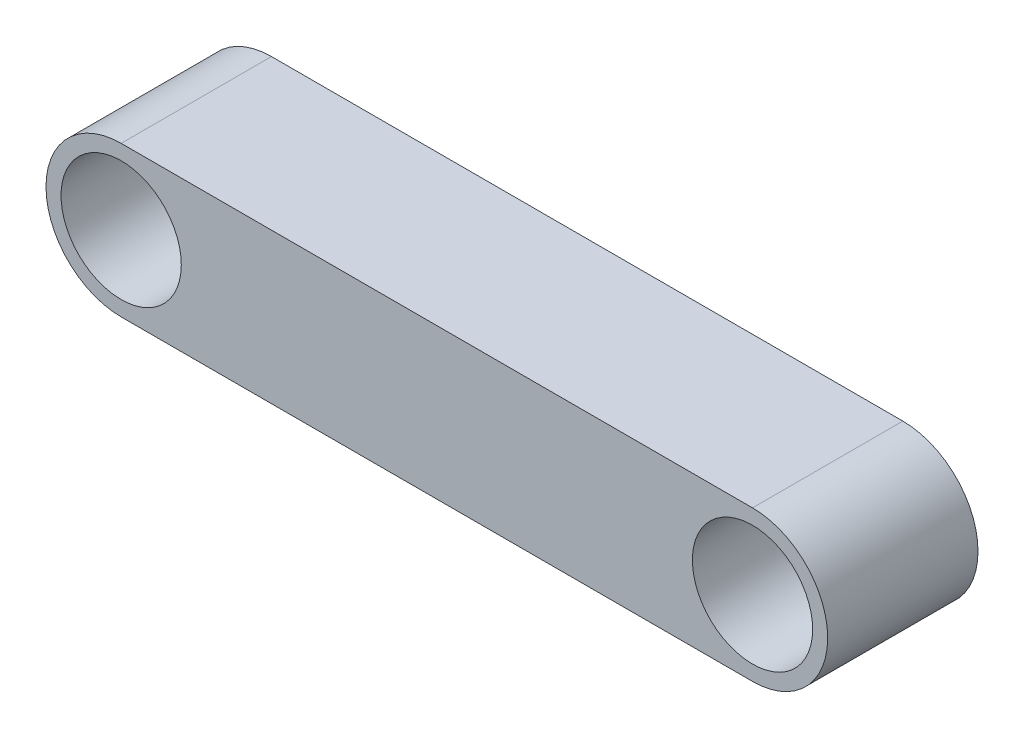
ISO-10303-21;
HEADER;
FILE_DESCRIPTION(('STEP AP214'),'2;1');
FILE_NAME('part.step','',(''),(''),'','','');
FILE_SCHEMA(('AUTOMOTIVE_DESIGN { 1 0 10303 214 1 1 1 1 }'));
ENDSEC;
DATA;
#1=APPLICATION_CONTEXT('core data for automotive mechanical design processes');
#2=APPLICATION_PROTOCOL_DEFINITION('international standard','automotive_design',2000,#1);
#3=PRODUCT_CONTEXT('',#1,'mechanical');
#4=PRODUCT('Part','Part','',(#3));
#5=PRODUCT_RELATED_PRODUCT_CATEGORY('part','',(#4));
#6=PRODUCT_DEFINITION_FORMATION('','',#4);
#7=PRODUCT_DEFINITION_CONTEXT('part definition',#1,'design');
#8=PRODUCT_DEFINITION('design','',#6,#7);
#9=PRODUCT_DEFINITION_SHAPE('','',#8);
#10=(LENGTH_UNIT() NAMED_UNIT(*) SI_UNIT(.MILLI.,.METRE.));
#11=(NAMED_UNIT(*) PLANE_ANGLE_UNIT() SI_UNIT($,.RADIAN.));
#12=(NAMED_UNIT(*) SI_UNIT($,.STERADIAN.) SOLID_ANGLE_UNIT());
#13=UNCERTAINTY_MEASURE_WITH_UNIT(LENGTH_MEASURE(1.E-05),#10,'distance_accuracy_value','');
#14=(GEOMETRIC_REPRESENTATION_CONTEXT(3) GLOBAL_UNCERTAINTY_ASSIGNED_CONTEXT((#13)) GLOBAL_UNIT_ASSIGNED_CONTEXT((#10,
#11,#12)) REPRESENTATION_CONTEXT('',''));
#15=CARTESIAN_POINT('',(0.,0.,0.));
#16=DIRECTION('',(0.,0.,1.));
#17=DIRECTION('',(1.,0.,0.));
#18=AXIS2_PLACEMENT_3D('',#15,#16,#17);
#19=CARTESIAN_POINT('',(0.,0.,10.));
#20=DIRECTION('',(0.,0.,1.));
#21=DIRECTION('',(1.,0.,0.));
#22=AXIS2_PLACEMENT_3D('',#19,#20,#21);
#23=PLANE('',#22);
#24=CARTESIAN_POINT('',(0.,0.,10.));
#25=DIRECTION('',(0.,0.,1.));
#26=DIRECTION('',(1.,0.,0.));
#27=AXIS2_PLACEMENT_3D('',#24,#25,#26);
#28=CIRCLE('',#27,4.);
#29=CARTESIAN_POINT('',(4.,0.,10.));
#30=VERTEX_POINT('',#29);
#31=EDGE_CURVE('E112',#30,#30,#28,.T.);
#32=ORIENTED_EDGE('',*,*,#31,.F.);
#33=EDGE_LOOP('',(#32));
#34=FACE_BOUND('',#33,.T.);
#35=CARTESIAN_POINT('',(0.,0.,10.));
#36=DIRECTION('',(0.,0.,1.));
#37=DIRECTION('',(1.,0.,0.));
#38=AXIS2_PLACEMENT_3D('',#35,#36,#37);
#39=CIRCLE('',#38,5.);
#40=CARTESIAN_POINT('',(0.,5.,10.));
#41=VERTEX_POINT('',#40);
#42=CARTESIAN_POINT('',(0.,-5.,10.));
#43=VERTEX_POINT('',#42);
#44=EDGE_CURVE('E92',#41,#43,#39,.T.);
#45=ORIENTED_EDGE('',*,*,#44,.T.);
#46=DIRECTION('',(1.,0.,0.));
#47=VECTOR('',#46,1.);
#48=CARTESIAN_POINT('',(0.,-5.,10.));
#49=LINE('',#48,#47);
#50=CARTESIAN_POINT('',(42.,-5.,10.));
#51=VERTEX_POINT('',#50);
#52=EDGE_CURVE('E87',#43,#51,#49,.T.);
#53=ORIENTED_EDGE('',*,*,#52,.T.);
#54=CARTESIAN_POINT('',(42.,0.,10.));
#55=DIRECTION('',(0.,0.,1.));
#56=DIRECTION('',(1.,0.,0.));
#57=AXIS2_PLACEMENT_3D('',#54,#55,#56);
#58=CIRCLE('',#57,5.);
#59=CARTESIAN_POINT('',(42.,5.,10.));
#60=VERTEX_POINT('',#59);
#61=EDGE_CURVE('E90',#51,#60,#58,.T.);
#62=ORIENTED_EDGE('',*,*,#61,.T.);
#63=DIRECTION('',(-1.,0.,0.));
#64=VECTOR('',#63,1.);
#65=CARTESIAN_POINT('',(0.,5.,10.));
#66=LINE('',#65,#64);
#67=EDGE_CURVE('E57',#60,#41,#66,.T.);
#68=ORIENTED_EDGE('',*,*,#67,.T.);
#69=EDGE_LOOP('',(#45,#53,#62,#68));
#70=FACE_BOUND('',#69,.T.);
#71=CARTESIAN_POINT('',(42.,0.,10.));
#72=DIRECTION('',(0.,0.,1.));
#73=DIRECTION('',(1.,0.,0.));
#74=AXIS2_PLACEMENT_3D('',#71,#72,#73);
#75=CIRCLE('',#74,4.00000000000001);
#76=CARTESIAN_POINT('',(46.,0.,10.));
#77=VERTEX_POINT('',#76);
#78=EDGE_CURVE('E134',#77,#77,#75,.T.);
#79=ORIENTED_EDGE('',*,*,#78,.F.);
#80=EDGE_LOOP('',(#79));
#81=FACE_BOUND('',#80,.T.);
#82=ADVANCED_FACE('F39',(#34,#70,#81),#23,.T.);
#83=CARTESIAN_POINT('',(0.,0.,0.));
#84=DIRECTION('',(0.,0.,1.));
#85=DIRECTION('',(1.,0.,0.));
#86=AXIS2_PLACEMENT_3D('',#83,#84,#85);
#87=PLANE('',#86);
#88=CARTESIAN_POINT('',(0.,0.,0.));
#89=DIRECTION('',(0.,0.,1.));
#90=DIRECTION('',(1.,0.,0.));
#91=AXIS2_PLACEMENT_3D('',#88,#89,#90);
#92=CIRCLE('',#91,5.);
#93=CARTESIAN_POINT('',(0.,5.,0.));
#94=VERTEX_POINT('',#93);
#95=CARTESIAN_POINT('',(0.,-5.,0.));
#96=VERTEX_POINT('',#95);
#97=EDGE_CURVE('E108',#94,#96,#92,.T.);
#98=ORIENTED_EDGE('',*,*,#97,.F.);
#99=DIRECTION('',(-1.,0.,0.));
#100=VECTOR('',#99,1.);
#101=CARTESIAN_POINT('',(0.,5.,0.));
#102=LINE('',#101,#100);
#103=CARTESIAN_POINT('',(42.,5.,0.));
#104=VERTEX_POINT('',#103);
#105=EDGE_CURVE('E80',#104,#94,#102,.T.);
#106=ORIENTED_EDGE('',*,*,#105,.F.);
#107=CARTESIAN_POINT('',(42.,0.,0.));
#108=DIRECTION('',(0.,0.,1.));
#109=DIRECTION('',(1.,0.,0.));
#110=AXIS2_PLACEMENT_3D('',#107,#108,#109);
#111=CIRCLE('',#110,5.);
#112=CARTESIAN_POINT('',(42.,-5.,0.));
#113=VERTEX_POINT('',#112);
#114=EDGE_CURVE('E74',#113,#104,#111,.T.);
#115=ORIENTED_EDGE('',*,*,#114,.F.);
#116=DIRECTION('',(1.,0.,0.));
#117=VECTOR('',#116,1.);
#118=CARTESIAN_POINT('',(0.,-5.,0.));
#119=LINE('',#118,#117);
#120=EDGE_CURVE('E97',#96,#113,#119,.T.);
#121=ORIENTED_EDGE('',*,*,#120,.F.);
#122=EDGE_LOOP('',(#98,#106,#115,#121));
#123=FACE_BOUND('',#122,.T.);
#124=CARTESIAN_POINT('',(0.,0.,0.));
#125=DIRECTION('',(0.,0.,1.));
#126=DIRECTION('',(1.,0.,0.));
#127=AXIS2_PLACEMENT_3D('',#124,#125,#126);
#128=CIRCLE('',#127,4.);
#129=CARTESIAN_POINT('',(4.,0.,0.));
#130=VERTEX_POINT('',#129);
#131=EDGE_CURVE('E130',#130,#130,#128,.T.);
#132=ORIENTED_EDGE('',*,*,#131,.T.);
#133=EDGE_LOOP('',(#132));
#134=FACE_BOUND('',#133,.T.);
#135=CARTESIAN_POINT('',(42.,0.,0.));
#136=DIRECTION('',(0.,0.,1.));
#137=DIRECTION('',(1.,0.,0.));
#138=AXIS2_PLACEMENT_3D('',#135,#136,#137);
#139=CIRCLE('',#138,4.00000000000001);
#140=CARTESIAN_POINT('',(46.,0.,0.));
#141=VERTEX_POINT('',#140);
#142=EDGE_CURVE('E138',#141,#141,#139,.T.);
#143=ORIENTED_EDGE('',*,*,#142,.T.);
#144=EDGE_LOOP('',(#143));
#145=FACE_BOUND('',#144,.T.);
#146=ADVANCED_FACE('F125',(#123,#134,#145),#87,.F.);
#147=CARTESIAN_POINT('',(0.,0.,10.));
#148=DIRECTION('',(0.,0.,-1.));
#149=DIRECTION('',(-1.,0.,0.));
#150=AXIS2_PLACEMENT_3D('',#147,#148,#149);
#151=CYLINDRICAL_SURFACE('',#150,5.);
#152=ORIENTED_EDGE('',*,*,#97,.T.);
#153=DIRECTION('',(0.,0.,-1.));
#154=VECTOR('',#153,1.);
#155=CARTESIAN_POINT('',(0.,-5.,10.));
#156=LINE('',#155,#154);
#157=EDGE_CURVE('E11',#43,#96,#156,.T.);
#158=ORIENTED_EDGE('',*,*,#157,.F.);
#159=ORIENTED_EDGE('',*,*,#44,.F.);
#160=DIRECTION('',(0.,0.,-1.));
#161=VECTOR('',#160,1.);
#162=CARTESIAN_POINT('',(0.,5.,10.));
#163=LINE('',#162,#161);
#164=EDGE_CURVE('E104',#41,#94,#163,.T.);
#165=ORIENTED_EDGE('',*,*,#164,.T.);
#166=EDGE_LOOP('',(#152,#158,#159,#165));
#167=FACE_BOUND('',#166,.T.);
#168=ADVANCED_FACE('F41',(#167),#151,.T.);
#169=CARTESIAN_POINT('',(0.,-5.,10.));
#170=DIRECTION('',(0.,1.,0.));
#171=DIRECTION('',(0.,0.,1.));
#172=AXIS2_PLACEMENT_3D('',#169,#170,#171);
#173=PLANE('',#172);
#174=ORIENTED_EDGE('',*,*,#120,.T.);
#175=DIRECTION('',(0.,0.,-1.));
#176=VECTOR('',#175,1.);
#177=CARTESIAN_POINT('',(42.,-5.,10.));
#178=LINE('',#177,#176);
#179=EDGE_CURVE('E49',#51,#113,#178,.T.);
#180=ORIENTED_EDGE('',*,*,#179,.F.);
#181=ORIENTED_EDGE('',*,*,#52,.F.);
#182=ORIENTED_EDGE('',*,*,#157,.T.);
#183=EDGE_LOOP('',(#174,#180,#181,#182));
#184=FACE_BOUND('',#183,.T.);
#185=ADVANCED_FACE('F96',(#184),#173,.F.);
#186=CARTESIAN_POINT('',(42.,0.,10.));
#187=DIRECTION('',(0.,0.,-1.));
#188=DIRECTION('',(-1.,0.,0.));
#189=AXIS2_PLACEMENT_3D('',#186,#187,#188);
#190=CYLINDRICAL_SURFACE('',#189,5.);
#191=ORIENTED_EDGE('',*,*,#114,.T.);
#192=DIRECTION('',(0.,0.,-1.));
#193=VECTOR('',#192,1.);
#194=CARTESIAN_POINT('',(42.,5.,10.));
#195=LINE('',#194,#193);
#196=EDGE_CURVE('E99',#60,#104,#195,.T.);
#197=ORIENTED_EDGE('',*,*,#196,.F.);
#198=ORIENTED_EDGE('',*,*,#61,.F.);
#199=ORIENTED_EDGE('',*,*,#179,.T.);
#200=EDGE_LOOP('',(#191,#197,#198,#199));
#201=FACE_BOUND('',#200,.T.);
#202=ADVANCED_FACE('F100',(#201),#190,.T.);
#203=CARTESIAN_POINT('',(0.,5.,10.));
#204=DIRECTION('',(0.,-1.,0.));
#205=DIRECTION('',(0.,0.,-1.));
#206=AXIS2_PLACEMENT_3D('',#203,#204,#205);
#207=PLANE('',#206);
#208=ORIENTED_EDGE('',*,*,#105,.T.);
#209=ORIENTED_EDGE('',*,*,#164,.F.);
#210=ORIENTED_EDGE('',*,*,#67,.F.);
#211=ORIENTED_EDGE('',*,*,#196,.T.);
#212=EDGE_LOOP('',(#208,#209,#210,#211));
#213=FACE_BOUND('',#212,.T.);
#214=ADVANCED_FACE('F122',(#213),#207,.F.);
#215=CARTESIAN_POINT('',(0.,0.,10.));
#216=DIRECTION('',(0.,0.,-1.));
#217=DIRECTION('',(-1.,0.,0.));
#218=AXIS2_PLACEMENT_3D('',#215,#216,#217);
#219=CYLINDRICAL_SURFACE('',#218,4.);
#220=ORIENTED_EDGE('',*,*,#31,.T.);
#221=EDGE_LOOP('',(#220));
#222=FACE_BOUND('',#221,.T.);
#223=ORIENTED_EDGE('',*,*,#131,.F.);
#224=EDGE_LOOP('',(#223));
#225=FACE_BOUND('',#224,.T.);
#226=ADVANCED_FACE('F157',(#222,#225),#219,.F.);
#227=CARTESIAN_POINT('',(42.,0.,10.));
#228=DIRECTION('',(0.,0.,-1.));
#229=DIRECTION('',(-1.,0.,0.));
#230=AXIS2_PLACEMENT_3D('',#227,#228,#229);
#231=CYLINDRICAL_SURFACE('',#230,4.00000000000001);
#232=ORIENTED_EDGE('',*,*,#78,.T.);
#233=EDGE_LOOP('',(#232));
#234=FACE_BOUND('',#233,.T.);
#235=ORIENTED_EDGE('',*,*,#142,.F.);
#236=EDGE_LOOP('',(#235));
#237=FACE_BOUND('',#236,.T.);
#238=ADVANCED_FACE('F146',(#234,#237),#231,.F.);
#239=CLOSED_SHELL('',(#82,#146,#168,#185,#202,#214,#226,#238));
#240=MANIFOLD_SOLID_BREP('B2',#239);
#241=ADVANCED_BREP_SHAPE_REPRESENTATION('',(#18,#240),#14);
#242=SHAPE_DEFINITION_REPRESENTATION(#9,#241);
ENDSEC;
END-ISO-10303-21;
